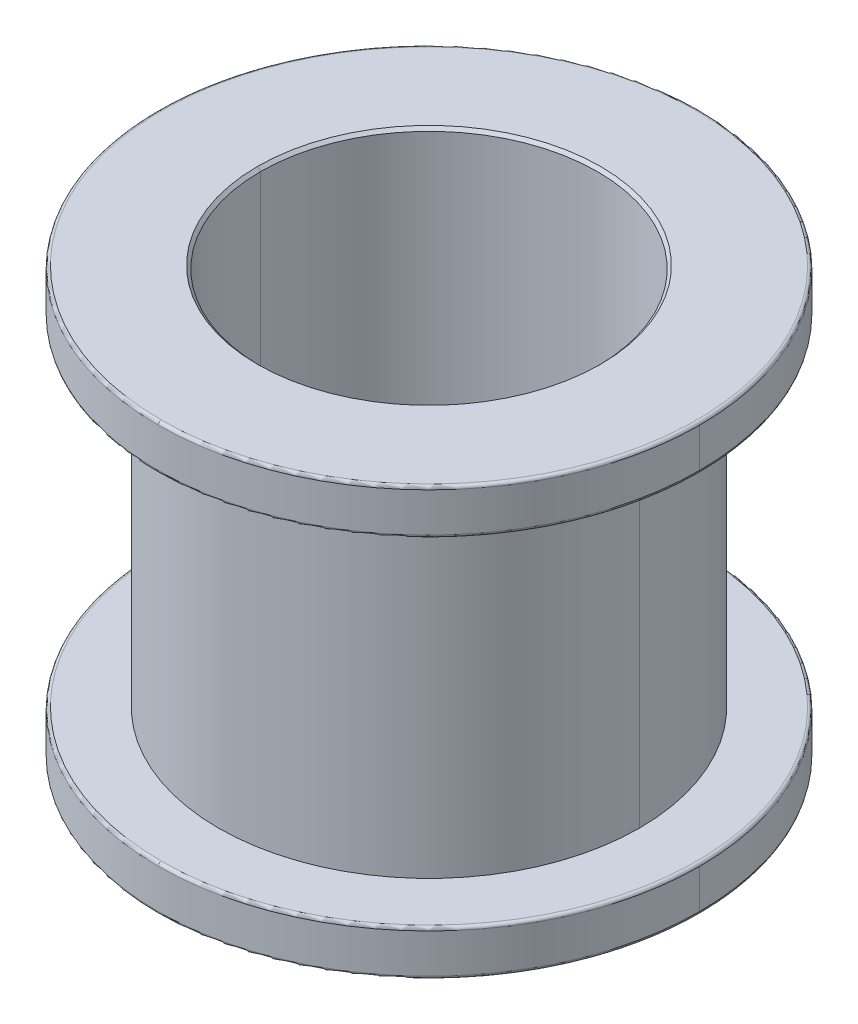
ISO-10303-21;
HEADER;
FILE_DESCRIPTION(('STEP AP214'),'2;1');
FILE_NAME('part.step','',(''),(''),'','','');
FILE_SCHEMA(('AUTOMOTIVE_DESIGN { 1 0 10303 214 1 1 1 1 }'));
ENDSEC;
DATA;
#1=APPLICATION_CONTEXT('core data for automotive mechanical design processes');
#2=APPLICATION_PROTOCOL_DEFINITION('international standard','automotive_design',2000,#1);
#3=PRODUCT_CONTEXT('',#1,'mechanical');
#4=PRODUCT('Part','Part','',(#3));
#5=PRODUCT_RELATED_PRODUCT_CATEGORY('part','',(#4));
#6=PRODUCT_DEFINITION_FORMATION('','',#4);
#7=PRODUCT_DEFINITION_CONTEXT('part definition',#1,'design');
#8=PRODUCT_DEFINITION('design','',#6,#7);
#9=PRODUCT_DEFINITION_SHAPE('','',#8);
#10=(LENGTH_UNIT() NAMED_UNIT(*) SI_UNIT(.MILLI.,.METRE.));
#11=(NAMED_UNIT(*) PLANE_ANGLE_UNIT() SI_UNIT($,.RADIAN.));
#12=(NAMED_UNIT(*) SI_UNIT($,.STERADIAN.) SOLID_ANGLE_UNIT());
#13=UNCERTAINTY_MEASURE_WITH_UNIT(LENGTH_MEASURE(1.E-05),#10,'distance_accuracy_value','');
#14=(GEOMETRIC_REPRESENTATION_CONTEXT(3) GLOBAL_UNCERTAINTY_ASSIGNED_CONTEXT((#13)) GLOBAL_UNIT_ASSIGNED_CONTEXT((#10,
#11,#12)) REPRESENTATION_CONTEXT('',''));
#15=CARTESIAN_POINT('',(0.,0.,0.));
#16=DIRECTION('',(0.,0.,1.));
#17=DIRECTION('',(1.,0.,0.));
#18=AXIS2_PLACEMENT_3D('',#15,#16,#17);
#19=CARTESIAN_POINT('',(0.,12.8,0.));
#20=DIRECTION('',(0.,-1.,0.));
#21=DIRECTION('',(0.,0.,-1.));
#22=AXIS2_PLACEMENT_3D('',#19,#20,#21);
#23=TOROIDAL_SURFACE('',#22,8.9,0.1);
#24=CARTESIAN_POINT('',(0.,12.8,-8.9));
#25=DIRECTION('',(1.,0.,0.));
#26=DIRECTION('',(0.,-1.,0.));
#27=AXIS2_PLACEMENT_3D('',#24,#25,#26);
#28=CIRCLE('',#27,0.1);
#29=CARTESIAN_POINT('',(0.,12.7,-8.9));
#30=VERTEX_POINT('',#29);
#31=CARTESIAN_POINT('',(0.,12.8,-9.));
#32=VERTEX_POINT('',#31);
#33=EDGE_CURVE('E273',#30,#32,#28,.T.);
#34=ORIENTED_EDGE('',*,*,#33,.T.);
#35=CARTESIAN_POINT('',(0.,12.8,0.));
#36=DIRECTION('',(0.,-1.,0.));
#37=DIRECTION('',(1.,0.,0.));
#38=AXIS2_PLACEMENT_3D('',#35,#36,#37);
#39=CIRCLE('',#38,9.);
#40=CARTESIAN_POINT('',(9.,12.8,0.));
#41=VERTEX_POINT('',#40);
#42=EDGE_CURVE('E327',#32,#41,#39,.T.);
#43=ORIENTED_EDGE('',*,*,#42,.T.);
#44=CARTESIAN_POINT('',(0.,12.8,0.));
#45=DIRECTION('',(0.,-1.,0.));
#46=DIRECTION('',(1.,0.,0.));
#47=AXIS2_PLACEMENT_3D('',#44,#45,#46);
#48=CIRCLE('',#47,9.);
#49=CARTESIAN_POINT('',(0.,12.8,9.));
#50=VERTEX_POINT('',#49);
#51=EDGE_CURVE('E277',#41,#50,#48,.T.);
#52=ORIENTED_EDGE('',*,*,#51,.T.);
#53=CARTESIAN_POINT('',(0.,12.8,8.9));
#54=DIRECTION('',(-1.,0.,0.));
#55=DIRECTION('',(0.,1.,0.));
#56=AXIS2_PLACEMENT_3D('',#53,#54,#55);
#57=CIRCLE('',#56,0.1);
#58=CARTESIAN_POINT('',(0.,12.7,8.9));
#59=VERTEX_POINT('',#58);
#60=EDGE_CURVE('E251',#59,#50,#57,.T.);
#61=ORIENTED_EDGE('',*,*,#60,.F.);
#62=CARTESIAN_POINT('',(0.,12.7,0.));
#63=DIRECTION('',(0.,1.,0.));
#64=DIRECTION('',(1.,0.,0.));
#65=AXIS2_PLACEMENT_3D('',#62,#63,#64);
#66=CIRCLE('',#65,8.9);
#67=EDGE_CURVE('E281',#59,#30,#66,.T.);
#68=ORIENTED_EDGE('',*,*,#67,.T.);
#69=EDGE_LOOP('',(#34,#43,#52,#61,#68));
#70=FACE_BOUND('',#69,.T.);
#71=ADVANCED_FACE('F17',(#70),#23,.T.);
#72=CARTESIAN_POINT('',(0.,14.1,0.));
#73=DIRECTION('',(0.,1.,0.));
#74=DIRECTION('',(0.,0.,-1.));
#75=AXIS2_PLACEMENT_3D('',#72,#73,#74);
#76=TOROIDAL_SURFACE('',#75,8.9,0.1);
#77=CARTESIAN_POINT('',(0.,14.1,8.9));
#78=DIRECTION('',(1.,0.,0.));
#79=DIRECTION('',(0.,-1.,0.));
#80=AXIS2_PLACEMENT_3D('',#77,#78,#79);
#81=CIRCLE('',#80,0.1);
#82=CARTESIAN_POINT('',(0.,14.2,8.9));
#83=VERTEX_POINT('',#82);
#84=CARTESIAN_POINT('',(0.,14.1,9.));
#85=VERTEX_POINT('',#84);
#86=EDGE_CURVE('E27',#83,#85,#81,.T.);
#87=ORIENTED_EDGE('',*,*,#86,.F.);
#88=CARTESIAN_POINT('',(0.,14.2,0.));
#89=DIRECTION('',(0.,-1.,0.));
#90=DIRECTION('',(1.,0.,0.));
#91=AXIS2_PLACEMENT_3D('',#88,#89,#90);
#92=CIRCLE('',#91,8.9);
#93=CARTESIAN_POINT('',(0.,14.2,-8.9));
#94=VERTEX_POINT('',#93);
#95=EDGE_CURVE('E294',#83,#94,#92,.T.);
#96=ORIENTED_EDGE('',*,*,#95,.T.);
#97=CARTESIAN_POINT('',(0.,14.1,-8.9));
#98=DIRECTION('',(-1.,0.,0.));
#99=DIRECTION('',(0.,1.,0.));
#100=AXIS2_PLACEMENT_3D('',#97,#98,#99);
#101=CIRCLE('',#100,0.1);
#102=CARTESIAN_POINT('',(0.,14.1,-9.));
#103=VERTEX_POINT('',#102);
#104=EDGE_CURVE('E11',#94,#103,#101,.T.);
#105=ORIENTED_EDGE('',*,*,#104,.T.);
#106=CARTESIAN_POINT('',(0.,14.1,0.));
#107=DIRECTION('',(0.,1.,0.));
#108=DIRECTION('',(1.,0.,0.));
#109=AXIS2_PLACEMENT_3D('',#106,#107,#108);
#110=CIRCLE('',#109,9.);
#111=CARTESIAN_POINT('',(-9.,14.1,0.));
#112=VERTEX_POINT('',#111);
#113=EDGE_CURVE('E308',#103,#112,#110,.T.);
#114=ORIENTED_EDGE('',*,*,#113,.T.);
#115=CARTESIAN_POINT('',(0.,14.1,0.));
#116=DIRECTION('',(0.,1.,0.));
#117=DIRECTION('',(1.,0.,0.));
#118=AXIS2_PLACEMENT_3D('',#115,#116,#117);
#119=CIRCLE('',#118,9.);
#120=EDGE_CURVE('E240',#112,#85,#119,.T.);
#121=ORIENTED_EDGE('',*,*,#120,.T.);
#122=EDGE_LOOP('',(#87,#96,#105,#114,#121));
#123=FACE_BOUND('',#122,.T.);
#124=ADVANCED_FACE('F655',(#123),#76,.T.);
#125=CARTESIAN_POINT('',(0.,14.1,0.));
#126=DIRECTION('',(0.,1.,0.));
#127=DIRECTION('',(0.,0.,1.));
#128=AXIS2_PLACEMENT_3D('',#125,#126,#127);
#129=TOROIDAL_SURFACE('',#128,8.9,0.1);
#130=ORIENTED_EDGE('',*,*,#86,.T.);
#131=CARTESIAN_POINT('',(0.,14.1,0.));
#132=DIRECTION('',(0.,1.,0.));
#133=DIRECTION('',(1.,0.,0.));
#134=AXIS2_PLACEMENT_3D('',#131,#132,#133);
#135=CIRCLE('',#134,9.);
#136=CARTESIAN_POINT('',(9.,14.1,0.));
#137=VERTEX_POINT('',#136);
#138=EDGE_CURVE('E237',#85,#137,#135,.T.);
#139=ORIENTED_EDGE('',*,*,#138,.T.);
#140=CARTESIAN_POINT('',(0.,14.1,0.));
#141=DIRECTION('',(0.,1.,0.));
#142=DIRECTION('',(1.,0.,0.));
#143=AXIS2_PLACEMENT_3D('',#140,#141,#142);
#144=CIRCLE('',#143,9.);
#145=EDGE_CURVE('E241',#137,#103,#144,.T.);
#146=ORIENTED_EDGE('',*,*,#145,.T.);
#147=ORIENTED_EDGE('',*,*,#104,.F.);
#148=CARTESIAN_POINT('',(0.,14.2,0.));
#149=DIRECTION('',(0.,-1.,0.));
#150=DIRECTION('',(1.,0.,0.));
#151=AXIS2_PLACEMENT_3D('',#148,#149,#150);
#152=CIRCLE('',#151,8.9);
#153=EDGE_CURVE('E272',#94,#83,#152,.T.);
#154=ORIENTED_EDGE('',*,*,#153,.T.);
#155=EDGE_LOOP('',(#130,#139,#146,#147,#154));
#156=FACE_BOUND('',#155,.T.);
#157=ADVANCED_FACE('F359',(#156),#129,.T.);
#158=CARTESIAN_POINT('',(0.,7.1,0.));
#159=DIRECTION('',(0.,1.,0.));
#160=DIRECTION('',(1.,0.,0.));
#161=AXIS2_PLACEMENT_3D('',#158,#159,#160);
#162=CYLINDRICAL_SURFACE('',#161,7.);
#163=DIRECTION('',(0.,-1.,0.));
#164=VECTOR('',#163,1.);
#165=CARTESIAN_POINT('',(7.,7.09999999963,0.));
#166=LINE('',#165,#164);
#167=CARTESIAN_POINT('',(7.,12.7,0.));
#168=VERTEX_POINT('',#167);
#169=CARTESIAN_POINT('',(7.,1.5,0.));
#170=VERTEX_POINT('',#169);
#171=EDGE_CURVE('E166',#168,#170,#166,.T.);
#172=ORIENTED_EDGE('',*,*,#171,.F.);
#173=CARTESIAN_POINT('',(0.,12.7,0.));
#174=DIRECTION('',(0.,-1.,0.));
#175=DIRECTION('',(1.,0.,0.));
#176=AXIS2_PLACEMENT_3D('',#173,#174,#175);
#177=CIRCLE('',#176,7.);
#178=CARTESIAN_POINT('',(-7.,12.7,0.));
#179=VERTEX_POINT('',#178);
#180=EDGE_CURVE('E288',#168,#179,#177,.T.);
#181=ORIENTED_EDGE('',*,*,#180,.T.);
#182=DIRECTION('',(0.,-1.,0.));
#183=VECTOR('',#182,1.);
#184=CARTESIAN_POINT('',(-7.,7.09999999963,0.));
#185=LINE('',#184,#183);
#186=CARTESIAN_POINT('',(-7.,1.5,0.));
#187=VERTEX_POINT('',#186);
#188=EDGE_CURVE('E177',#179,#187,#185,.T.);
#189=ORIENTED_EDGE('',*,*,#188,.T.);
#190=CARTESIAN_POINT('',(0.,1.5,0.));
#191=DIRECTION('',(0.,1.,0.));
#192=DIRECTION('',(-1.,0.,0.));
#193=AXIS2_PLACEMENT_3D('',#190,#191,#192);
#194=CIRCLE('',#193,7.);
#195=EDGE_CURVE('E341',#187,#170,#194,.T.);
#196=ORIENTED_EDGE('',*,*,#195,.T.);
#197=EDGE_LOOP('',(#172,#181,#189,#196));
#198=FACE_BOUND('',#197,.T.);
#199=ADVANCED_FACE('F348',(#198),#162,.T.);
#200=CARTESIAN_POINT('',(0.,7.1,0.));
#201=DIRECTION('',(0.,1.,0.));
#202=DIRECTION('',(1.,0.,0.));
#203=AXIS2_PLACEMENT_3D('',#200,#201,#202);
#204=CYLINDRICAL_SURFACE('',#203,7.);
#205=ORIENTED_EDGE('',*,*,#171,.T.);
#206=CARTESIAN_POINT('',(0.,1.50000000037,0.));
#207=DIRECTION('',(0.,1.,0.));
#208=DIRECTION('',(1.,0.,0.));
#209=AXIS2_PLACEMENT_3D('',#206,#207,#208);
#210=CIRCLE('',#209,7.);
#211=EDGE_CURVE('E430',#170,#187,#210,.T.);
#212=ORIENTED_EDGE('',*,*,#211,.T.);
#213=ORIENTED_EDGE('',*,*,#188,.F.);
#214=CARTESIAN_POINT('',(0.,12.6999999996,0.));
#215=DIRECTION('',(0.,-1.,0.));
#216=DIRECTION('',(1.,0.,0.));
#217=AXIS2_PLACEMENT_3D('',#214,#215,#216);
#218=CIRCLE('',#217,7.);
#219=EDGE_CURVE('E298',#179,#168,#218,.T.);
#220=ORIENTED_EDGE('',*,*,#219,.T.);
#221=EDGE_LOOP('',(#205,#212,#213,#220));
#222=FACE_BOUND('',#221,.T.);
#223=ADVANCED_FACE('F358',(#222),#204,.T.);
#224=CARTESIAN_POINT('',(0.,14.15,0.));
#225=DIRECTION('',(0.,1.,0.));
#226=DIRECTION('',(-1.,0.,0.));
#227=AXIS2_PLACEMENT_3D('',#224,#225,#226);
#228=CONICAL_SURFACE('',#227,5.65,0.785398163397001);
#229=CARTESIAN_POINT('',(0.,14.2,0.));
#230=DIRECTION('',(0.,1.,0.));
#231=DIRECTION('',(1.,0.,0.));
#232=AXIS2_PLACEMENT_3D('',#229,#230,#231);
#233=CIRCLE('',#232,5.7);
#234=CARTESIAN_POINT('',(-5.69999999925,14.2,0.));
#235=VERTEX_POINT('',#234);
#236=CARTESIAN_POINT('',(5.69999999925,14.2,0.));
#237=VERTEX_POINT('',#236);
#238=EDGE_CURVE('E267',#235,#237,#233,.T.);
#239=ORIENTED_EDGE('',*,*,#238,.T.);
#240=DIRECTION('',(0.707106781186548,0.707106781186548,0.));
#241=VECTOR('',#240,1.);
#242=CARTESIAN_POINT('',(3535536.73093,3535545.23093,-3.52070369917E-10));
#243=LINE('',#242,#241);
#244=CARTESIAN_POINT('',(5.6,14.1,0.));
#245=VERTEX_POINT('',#244);
#246=EDGE_CURVE('E260',#245,#237,#243,.T.);
#247=ORIENTED_EDGE('',*,*,#246,.F.);
#248=CARTESIAN_POINT('',(0.,14.1,0.));
#249=DIRECTION('',(0.,-1.,0.));
#250=DIRECTION('',(1.,0.,0.));
#251=AXIS2_PLACEMENT_3D('',#248,#249,#250);
#252=CIRCLE('',#251,5.6);
#253=CARTESIAN_POINT('',(-5.6,14.1,0.));
#254=VERTEX_POINT('',#253);
#255=EDGE_CURVE('E315',#245,#254,#252,.T.);
#256=ORIENTED_EDGE('',*,*,#255,.T.);
#257=DIRECTION('',(0.707106781186548,-0.707106781186548,0.));
#258=VECTOR('',#257,1.);
#259=CARTESIAN_POINT('',(-3535536.73093,3535545.23093,-7.85048743997E-10));
#260=LINE('',#259,#258);
#261=EDGE_CURVE('E263',#235,#254,#260,.T.);
#262=ORIENTED_EDGE('',*,*,#261,.F.);
#263=EDGE_LOOP('',(#239,#247,#256,#262));
#264=FACE_BOUND('',#263,.T.);
#265=ADVANCED_FACE('F407',(#264),#228,.F.);
#266=CARTESIAN_POINT('',(0.,14.15,0.));
#267=DIRECTION('',(0.,1.,0.));
#268=DIRECTION('',(-1.,0.,0.));
#269=AXIS2_PLACEMENT_3D('',#266,#267,#268);
#270=CONICAL_SURFACE('',#269,5.65,0.785398163397001);
#271=CARTESIAN_POINT('',(0.,14.1,0.));
#272=DIRECTION('',(0.,-1.,0.));
#273=DIRECTION('',(1.,0.,0.));
#274=AXIS2_PLACEMENT_3D('',#271,#272,#273);
#275=CIRCLE('',#274,5.6);
#276=EDGE_CURVE('E224',#254,#245,#275,.T.);
#277=ORIENTED_EDGE('',*,*,#276,.T.);
#278=ORIENTED_EDGE('',*,*,#246,.T.);
#279=CARTESIAN_POINT('',(0.,14.2,0.));
#280=DIRECTION('',(0.,1.,0.));
#281=DIRECTION('',(1.,0.,0.));
#282=AXIS2_PLACEMENT_3D('',#279,#280,#281);
#283=CIRCLE('',#282,5.7);
#284=EDGE_CURVE('E271',#237,#235,#283,.T.);
#285=ORIENTED_EDGE('',*,*,#284,.T.);
#286=ORIENTED_EDGE('',*,*,#261,.T.);
#287=EDGE_LOOP('',(#277,#278,#285,#286));
#288=FACE_BOUND('',#287,.T.);
#289=ADVANCED_FACE('F621',(#288),#270,.F.);
#290=CARTESIAN_POINT('',(0.,1.4,0.));
#291=DIRECTION('',(0.,1.,0.));
#292=DIRECTION('',(0.,0.,-1.));
#293=AXIS2_PLACEMENT_3D('',#290,#291,#292);
#294=TOROIDAL_SURFACE('',#293,8.9,0.1);
#295=CARTESIAN_POINT('',(0.,1.4,8.9));
#296=DIRECTION('',(1.,0.,0.));
#297=DIRECTION('',(0.,-1.,0.));
#298=AXIS2_PLACEMENT_3D('',#295,#296,#297);
#299=CIRCLE('',#298,0.1);
#300=CARTESIAN_POINT('',(0.,1.5,8.9));
#301=VERTEX_POINT('',#300);
#302=CARTESIAN_POINT('',(0.,1.4,9.));
#303=VERTEX_POINT('',#302);
#304=EDGE_CURVE('E247',#301,#303,#299,.T.);
#305=ORIENTED_EDGE('',*,*,#304,.F.);
#306=CARTESIAN_POINT('',(0.,1.5,0.));
#307=DIRECTION('',(0.,-1.,0.));
#308=DIRECTION('',(1.,0.,0.));
#309=AXIS2_PLACEMENT_3D('',#306,#307,#308);
#310=CIRCLE('',#309,8.9);
#311=CARTESIAN_POINT('',(0.,1.5,-8.9));
#312=VERTEX_POINT('',#311);
#313=EDGE_CURVE('E282',#301,#312,#310,.T.);
#314=ORIENTED_EDGE('',*,*,#313,.T.);
#315=CARTESIAN_POINT('',(0.,1.4,-8.9));
#316=DIRECTION('',(-1.,0.,0.));
#317=DIRECTION('',(0.,1.,0.));
#318=AXIS2_PLACEMENT_3D('',#315,#316,#317);
#319=CIRCLE('',#318,0.1);
#320=CARTESIAN_POINT('',(0.,1.4,-9.));
#321=VERTEX_POINT('',#320);
#322=EDGE_CURVE('E250',#312,#321,#319,.T.);
#323=ORIENTED_EDGE('',*,*,#322,.T.);
#324=CARTESIAN_POINT('',(0.,1.4,0.));
#325=DIRECTION('',(0.,1.,0.));
#326=DIRECTION('',(1.,0.,0.));
#327=AXIS2_PLACEMENT_3D('',#324,#325,#326);
#328=CIRCLE('',#327,9.);
#329=CARTESIAN_POINT('',(-9.,1.4,0.));
#330=VERTEX_POINT('',#329);
#331=EDGE_CURVE('E242',#321,#330,#328,.T.);
#332=ORIENTED_EDGE('',*,*,#331,.T.);
#333=CARTESIAN_POINT('',(0.,1.4,0.));
#334=DIRECTION('',(0.,1.,0.));
#335=DIRECTION('',(1.,0.,0.));
#336=AXIS2_PLACEMENT_3D('',#333,#334,#335);
#337=CIRCLE('',#336,9.);
#338=EDGE_CURVE('E322',#330,#303,#337,.T.);
#339=ORIENTED_EDGE('',*,*,#338,.T.);
#340=EDGE_LOOP('',(#305,#314,#323,#332,#339));
#341=FACE_BOUND('',#340,.T.);
#342=ADVANCED_FACE('F394',(#341),#294,.T.);
#343=CARTESIAN_POINT('',(0.,1.4,0.));
#344=DIRECTION('',(0.,1.,0.));
#345=DIRECTION('',(0.,0.,1.));
#346=AXIS2_PLACEMENT_3D('',#343,#344,#345);
#347=TOROIDAL_SURFACE('',#346,8.9,0.1);
#348=ORIENTED_EDGE('',*,*,#304,.T.);
#349=CARTESIAN_POINT('',(0.,1.4,0.));
#350=DIRECTION('',(0.,1.,0.));
#351=DIRECTION('',(1.,0.,0.));
#352=AXIS2_PLACEMENT_3D('',#349,#350,#351);
#353=CIRCLE('',#352,9.);
#354=CARTESIAN_POINT('',(9.,1.4,0.));
#355=VERTEX_POINT('',#354);
#356=EDGE_CURVE('E319',#303,#355,#353,.T.);
#357=ORIENTED_EDGE('',*,*,#356,.T.);
#358=CARTESIAN_POINT('',(0.,1.4,0.));
#359=DIRECTION('',(0.,1.,0.));
#360=DIRECTION('',(1.,0.,0.));
#361=AXIS2_PLACEMENT_3D('',#358,#359,#360);
#362=CIRCLE('',#361,9.);
#363=EDGE_CURVE('E246',#355,#321,#362,.T.);
#364=ORIENTED_EDGE('',*,*,#363,.T.);
#365=ORIENTED_EDGE('',*,*,#322,.F.);
#366=CARTESIAN_POINT('',(0.,1.5,0.));
#367=DIRECTION('',(0.,-1.,0.));
#368=DIRECTION('',(1.,0.,0.));
#369=AXIS2_PLACEMENT_3D('',#366,#367,#368);
#370=CIRCLE('',#369,8.9);
#371=EDGE_CURVE('E286',#312,#301,#370,.T.);
#372=ORIENTED_EDGE('',*,*,#371,.T.);
#373=EDGE_LOOP('',(#348,#357,#364,#365,#372));
#374=FACE_BOUND('',#373,.T.);
#375=ADVANCED_FACE('F408',(#374),#347,.T.);
#376=CARTESIAN_POINT('',(0.,0.05,0.));
#377=DIRECTION('',(0.,-1.,0.));
#378=DIRECTION('',(-1.,0.,0.));
#379=AXIS2_PLACEMENT_3D('',#376,#377,#378);
#380=CONICAL_SURFACE('',#379,5.65,0.785398163397001);
#381=CARTESIAN_POINT('',(0.,0.1,0.));
#382=DIRECTION('',(0.,1.,0.));
#383=DIRECTION('',(1.,0.,0.));
#384=AXIS2_PLACEMENT_3D('',#381,#382,#383);
#385=CIRCLE('',#384,5.6);
#386=CARTESIAN_POINT('',(-5.6,0.1,0.));
#387=VERTEX_POINT('',#386);
#388=CARTESIAN_POINT('',(5.6,0.100000000373,0.));
#389=VERTEX_POINT('',#388);
#390=EDGE_CURVE('E314',#387,#389,#385,.T.);
#391=ORIENTED_EDGE('',*,*,#390,.T.);
#392=DIRECTION('',(0.707106781186548,-0.707106781186548,0.));
#393=VECTOR('',#392,1.);
#394=CARTESIAN_POINT('',(3535536.73093,-3535531.03093,3.52067216883E-10));
#395=LINE('',#394,#393);
#396=CARTESIAN_POINT('',(5.69999999925,0.,0.));
#397=VERTEX_POINT('',#396);
#398=EDGE_CURVE('E266',#389,#397,#395,.T.);
#399=ORIENTED_EDGE('',*,*,#398,.T.);
#400=CARTESIAN_POINT('',(0.,0.,0.));
#401=DIRECTION('',(0.,-1.,0.));
#402=DIRECTION('',(1.,0.,0.));
#403=AXIS2_PLACEMENT_3D('',#400,#401,#402);
#404=CIRCLE('',#403,5.7);
#405=CARTESIAN_POINT('',(-5.69999999925,0.,0.));
#406=VERTEX_POINT('',#405);
#407=EDGE_CURVE('E96',#397,#406,#404,.T.);
#408=ORIENTED_EDGE('',*,*,#407,.T.);
#409=DIRECTION('',(0.707106781186548,0.707106781186548,0.));
#410=VECTOR('',#409,1.);
#411=CARTESIAN_POINT('',(-3535536.73093,-3535531.03093,1.65100233912E-09));
#412=LINE('',#411,#410);
#413=EDGE_CURVE('E234',#406,#387,#412,.T.);
#414=ORIENTED_EDGE('',*,*,#413,.T.);
#415=EDGE_LOOP('',(#391,#399,#408,#414));
#416=FACE_BOUND('',#415,.T.);
#417=ADVANCED_FACE('F411',(#416),#380,.F.);
#418=CARTESIAN_POINT('',(0.,0.1,0.));
#419=DIRECTION('',(0.,-1.,0.));
#420=DIRECTION('',(0.,0.,-1.));
#421=AXIS2_PLACEMENT_3D('',#418,#419,#420);
#422=TOROIDAL_SURFACE('',#421,8.9,0.1);
#423=CARTESIAN_POINT('',(0.,0.1,-8.9));
#424=DIRECTION('',(1.,0.,0.));
#425=DIRECTION('',(0.,-1.,0.));
#426=AXIS2_PLACEMENT_3D('',#423,#424,#425);
#427=CIRCLE('',#426,0.1);
#428=CARTESIAN_POINT('',(0.,0.,-8.9));
#429=VERTEX_POINT('',#428);
#430=CARTESIAN_POINT('',(0.,0.1,-9.));
#431=VERTEX_POINT('',#430);
#432=EDGE_CURVE('E192',#429,#431,#427,.T.);
#433=ORIENTED_EDGE('',*,*,#432,.T.);
#434=CARTESIAN_POINT('',(0.,0.1,0.));
#435=DIRECTION('',(0.,-1.,0.));
#436=DIRECTION('',(1.,0.,0.));
#437=AXIS2_PLACEMENT_3D('',#434,#435,#436);
#438=CIRCLE('',#437,9.);
#439=CARTESIAN_POINT('',(9.,0.1,0.));
#440=VERTEX_POINT('',#439);
#441=EDGE_CURVE('E196',#431,#440,#438,.T.);
#442=ORIENTED_EDGE('',*,*,#441,.T.);
#443=CARTESIAN_POINT('',(0.,0.1,0.));
#444=DIRECTION('',(0.,-1.,0.));
#445=DIRECTION('',(1.,0.,0.));
#446=AXIS2_PLACEMENT_3D('',#443,#444,#445);
#447=CIRCLE('',#446,9.);
#448=CARTESIAN_POINT('',(0.,0.1,9.));
#449=VERTEX_POINT('',#448);
#450=EDGE_CURVE('E339',#440,#449,#447,.T.);
#451=ORIENTED_EDGE('',*,*,#450,.T.);
#452=CARTESIAN_POINT('',(0.,0.1,8.9));
#453=DIRECTION('',(-1.,0.,0.));
#454=DIRECTION('',(0.,1.,0.));
#455=AXIS2_PLACEMENT_3D('',#452,#453,#454);
#456=CIRCLE('',#455,0.1);
#457=CARTESIAN_POINT('',(0.,0.,8.9));
#458=VERTEX_POINT('',#457);
#459=EDGE_CURVE('E42',#458,#449,#456,.T.);
#460=ORIENTED_EDGE('',*,*,#459,.F.);
#461=CARTESIAN_POINT('',(0.,0.,0.));
#462=DIRECTION('',(0.,1.,0.));
#463=DIRECTION('',(1.,0.,0.));
#464=AXIS2_PLACEMENT_3D('',#461,#462,#463);
#465=CIRCLE('',#464,8.9);
#466=EDGE_CURVE('E198',#458,#429,#465,.T.);
#467=ORIENTED_EDGE('',*,*,#466,.T.);
#468=EDGE_LOOP('',(#433,#442,#451,#460,#467));
#469=FACE_BOUND('',#468,.T.);
#470=ADVANCED_FACE('F194',(#469),#422,.T.);
#471=CARTESIAN_POINT('',(0.,0.1,0.));
#472=DIRECTION('',(0.,-1.,0.));
#473=DIRECTION('',(0.,0.,1.));
#474=AXIS2_PLACEMENT_3D('',#471,#472,#473);
#475=TOROIDAL_SURFACE('',#474,8.9,0.1);
#476=ORIENTED_EDGE('',*,*,#432,.F.);
#477=CARTESIAN_POINT('',(0.,0.,0.));
#478=DIRECTION('',(0.,1.,0.));
#479=DIRECTION('',(1.,0.,0.));
#480=AXIS2_PLACEMENT_3D('',#477,#478,#479);
#481=CIRCLE('',#480,8.9);
#482=EDGE_CURVE('E232',#429,#458,#481,.T.);
#483=ORIENTED_EDGE('',*,*,#482,.T.);
#484=ORIENTED_EDGE('',*,*,#459,.T.);
#485=CARTESIAN_POINT('',(0.,0.1,0.));
#486=DIRECTION('',(0.,-1.,0.));
#487=DIRECTION('',(1.,0.,0.));
#488=AXIS2_PLACEMENT_3D('',#485,#486,#487);
#489=CIRCLE('',#488,9.);
#490=CARTESIAN_POINT('',(-9.,0.1,0.));
#491=VERTEX_POINT('',#490);
#492=EDGE_CURVE('E206',#449,#491,#489,.T.);
#493=ORIENTED_EDGE('',*,*,#492,.T.);
#494=CARTESIAN_POINT('',(0.,0.1,0.));
#495=DIRECTION('',(0.,-1.,0.));
#496=DIRECTION('',(1.,0.,0.));
#497=AXIS2_PLACEMENT_3D('',#494,#495,#496);
#498=CIRCLE('',#497,9.);
#499=EDGE_CURVE('E203',#491,#431,#498,.T.);
#500=ORIENTED_EDGE('',*,*,#499,.T.);
#501=EDGE_LOOP('',(#476,#483,#484,#493,#500));
#502=FACE_BOUND('',#501,.T.);
#503=ADVANCED_FACE('F204',(#502),#475,.T.);
#504=CARTESIAN_POINT('',(0.,0.,0.));
#505=DIRECTION('',(0.,-1.,0.));
#506=DIRECTION('',(-1.,0.,0.));
#507=AXIS2_PLACEMENT_3D('',#504,#505,#506);
#508=PLANE('',#507);
#509=CARTESIAN_POINT('',(0.,0.,0.));
#510=DIRECTION('',(0.,-1.,0.));
#511=DIRECTION('',(1.,0.,0.));
#512=AXIS2_PLACEMENT_3D('',#509,#510,#511);
#513=CIRCLE('',#512,5.69999999925);
#514=EDGE_CURVE('E335',#406,#397,#513,.T.);
#515=ORIENTED_EDGE('',*,*,#514,.F.);
#516=ORIENTED_EDGE('',*,*,#407,.F.);
#517=EDGE_LOOP('',(#515,#516));
#518=FACE_BOUND('',#517,.T.);
#519=ORIENTED_EDGE('',*,*,#482,.F.);
#520=ORIENTED_EDGE('',*,*,#466,.F.);
#521=EDGE_LOOP('',(#519,#520));
#522=FACE_BOUND('',#521,.T.);
#523=ADVANCED_FACE('F704',(#518,#522),#508,.T.);
#524=CARTESIAN_POINT('',(0.,0.05,0.));
#525=DIRECTION('',(0.,-1.,0.));
#526=DIRECTION('',(-1.,0.,0.));
#527=AXIS2_PLACEMENT_3D('',#524,#525,#526);
#528=CONICAL_SURFACE('',#527,5.65,0.785398163397001);
#529=ORIENTED_EDGE('',*,*,#514,.T.);
#530=ORIENTED_EDGE('',*,*,#398,.F.);
#531=CARTESIAN_POINT('',(0.,0.1,0.));
#532=DIRECTION('',(0.,1.,0.));
#533=DIRECTION('',(1.,0.,0.));
#534=AXIS2_PLACEMENT_3D('',#531,#532,#533);
#535=CIRCLE('',#534,5.6);
#536=EDGE_CURVE('E259',#389,#387,#535,.T.);
#537=ORIENTED_EDGE('',*,*,#536,.T.);
#538=ORIENTED_EDGE('',*,*,#413,.F.);
#539=EDGE_LOOP('',(#529,#530,#537,#538));
#540=FACE_BOUND('',#539,.T.);
#541=ADVANCED_FACE('F403',(#540),#528,.F.);
#542=CARTESIAN_POINT('',(0.,0.8,0.));
#543=DIRECTION('',(0.,1.,0.));
#544=DIRECTION('',(1.,0.,0.));
#545=AXIS2_PLACEMENT_3D('',#542,#543,#544);
#546=CYLINDRICAL_SURFACE('',#545,9.);
#547=DIRECTION('',(0.,-1.,0.));
#548=VECTOR('',#547,1.);
#549=CARTESIAN_POINT('',(9.,0.800000000745,0.));
#550=LINE('',#549,#548);
#551=EDGE_CURVE('E216',#355,#440,#550,.T.);
#552=ORIENTED_EDGE('',*,*,#551,.F.);
#553=ORIENTED_EDGE('',*,*,#356,.F.);
#554=ORIENTED_EDGE('',*,*,#338,.F.);
#555=DIRECTION('',(0.,-1.,0.));
#556=VECTOR('',#555,1.);
#557=CARTESIAN_POINT('',(-9.,0.800000000745,0.));
#558=LINE('',#557,#556);
#559=EDGE_CURVE('E211',#330,#491,#558,.T.);
#560=ORIENTED_EDGE('',*,*,#559,.T.);
#561=ORIENTED_EDGE('',*,*,#492,.F.);
#562=ORIENTED_EDGE('',*,*,#450,.F.);
#563=EDGE_LOOP('',(#552,#553,#554,#560,#561,#562));
#564=FACE_BOUND('',#563,.T.);
#565=ADVANCED_FACE('F400',(#564),#546,.T.);
#566=CARTESIAN_POINT('',(0.,0.8,0.));
#567=DIRECTION('',(0.,1.,0.));
#568=DIRECTION('',(1.,0.,0.));
#569=AXIS2_PLACEMENT_3D('',#566,#567,#568);
#570=CYLINDRICAL_SURFACE('',#569,9.);
#571=ORIENTED_EDGE('',*,*,#551,.T.);
#572=ORIENTED_EDGE('',*,*,#441,.F.);
#573=ORIENTED_EDGE('',*,*,#499,.F.);
#574=ORIENTED_EDGE('',*,*,#559,.F.);
#575=ORIENTED_EDGE('',*,*,#331,.F.);
#576=ORIENTED_EDGE('',*,*,#363,.F.);
#577=EDGE_LOOP('',(#571,#572,#573,#574,#575,#576));
#578=FACE_BOUND('',#577,.T.);
#579=ADVANCED_FACE('F213',(#578),#570,.T.);
#580=CARTESIAN_POINT('',(0.,14.2,0.));
#581=DIRECTION('',(0.,-1.,0.));
#582=DIRECTION('',(-1.,0.,0.));
#583=AXIS2_PLACEMENT_3D('',#580,#581,#582);
#584=CYLINDRICAL_SURFACE('',#583,5.6);
#585=ORIENTED_EDGE('',*,*,#536,.F.);
#586=DIRECTION('',(0.,-1.,0.));
#587=VECTOR('',#586,1.);
#588=CARTESIAN_POINT('',(5.6,14.1999999993,0.));
#589=LINE('',#588,#587);
#590=EDGE_CURVE('E310',#245,#389,#589,.T.);
#591=ORIENTED_EDGE('',*,*,#590,.F.);
#592=ORIENTED_EDGE('',*,*,#276,.F.);
#593=DIRECTION('',(0.,1.,0.));
#594=VECTOR('',#593,1.);
#595=CARTESIAN_POINT('',(-5.6,14.1999999993,0.));
#596=LINE('',#595,#594);
#597=EDGE_CURVE('E305',#387,#254,#596,.T.);
#598=ORIENTED_EDGE('',*,*,#597,.F.);
#599=EDGE_LOOP('',(#585,#591,#592,#598));
#600=FACE_BOUND('',#599,.T.);
#601=ADVANCED_FACE('F395',(#600),#584,.F.);
#602=CARTESIAN_POINT('',(0.,14.2,0.));
#603=DIRECTION('',(0.,-1.,0.));
#604=DIRECTION('',(-1.,0.,0.));
#605=AXIS2_PLACEMENT_3D('',#602,#603,#604);
#606=CYLINDRICAL_SURFACE('',#605,5.6);
#607=ORIENTED_EDGE('',*,*,#255,.F.);
#608=ORIENTED_EDGE('',*,*,#590,.T.);
#609=ORIENTED_EDGE('',*,*,#390,.F.);
#610=ORIENTED_EDGE('',*,*,#597,.T.);
#611=EDGE_LOOP('',(#607,#608,#609,#610));
#612=FACE_BOUND('',#611,.T.);
#613=ADVANCED_FACE('F398',(#612),#606,.F.);
#614=CARTESIAN_POINT('',(0.,1.5,0.));
#615=DIRECTION('',(0.,1.,0.));
#616=DIRECTION('',(0.,0.,-1.));
#617=AXIS2_PLACEMENT_3D('',#614,#615,#616);
#618=PLANE('',#617);
#619=ORIENTED_EDGE('',*,*,#211,.F.);
#620=ORIENTED_EDGE('',*,*,#195,.F.);
#621=EDGE_LOOP('',(#619,#620));
#622=FACE_BOUND('',#621,.T.);
#623=ORIENTED_EDGE('',*,*,#313,.F.);
#624=ORIENTED_EDGE('',*,*,#371,.F.);
#625=EDGE_LOOP('',(#623,#624));
#626=FACE_BOUND('',#625,.T.);
#627=ADVANCED_FACE('F413',(#622,#626),#618,.T.);
#628=CARTESIAN_POINT('',(0.,14.2,0.));
#629=DIRECTION('',(0.,1.,0.));
#630=DIRECTION('',(0.,0.,-1.));
#631=AXIS2_PLACEMENT_3D('',#628,#629,#630);
#632=PLANE('',#631);
#633=ORIENTED_EDGE('',*,*,#238,.F.);
#634=ORIENTED_EDGE('',*,*,#284,.F.);
#635=EDGE_LOOP('',(#633,#634));
#636=FACE_BOUND('',#635,.T.);
#637=ORIENTED_EDGE('',*,*,#95,.F.);
#638=ORIENTED_EDGE('',*,*,#153,.F.);
#639=EDGE_LOOP('',(#637,#638));
#640=FACE_BOUND('',#639,.T.);
#641=ADVANCED_FACE('F393',(#636,#640),#632,.T.);
#642=CARTESIAN_POINT('',(0.,12.7,0.));
#643=DIRECTION('',(0.,-1.,0.));
#644=DIRECTION('',(-1.,0.,0.));
#645=AXIS2_PLACEMENT_3D('',#642,#643,#644);
#646=PLANE('',#645);
#647=ORIENTED_EDGE('',*,*,#180,.F.);
#648=ORIENTED_EDGE('',*,*,#219,.F.);
#649=EDGE_LOOP('',(#647,#648));
#650=FACE_BOUND('',#649,.T.);
#651=CARTESIAN_POINT('',(0.,12.7,-8.9));
#652=CARTESIAN_POINT('',(-0.876894150704,12.7,-8.90000000037));
#653=CARTESIAN_POINT('',(-1.75378787239,12.7,-8.79200233864));
#654=CARTESIAN_POINT('',(-2.61298956826,12.7,-8.57597607046));
#655=CARTESIAN_POINT('',(-4.2603851519,12.7,-7.93682179775));
#656=CARTESIAN_POINT('',(-5.70346674008,12.7,-6.91704736003));
#657=CARTESIAN_POINT('',(-6.35832657989,12.7,-6.32034517553));
#658=CARTESIAN_POINT('',(-7.50753229455,12.7,-4.9780498927));
#659=CARTESIAN_POINT('',(-8.29670326015,12.7,-3.39702694254));
#660=CARTESIAN_POINT('',(-8.59147743083,12.7,-2.56156116085));
#661=CARTESIAN_POINT('',(-8.96918032948,12.7,-0.835359858412));
#662=CARTESIAN_POINT('',(-8.91675395855,12.7,0.930900561993));
#663=CARTESIAN_POINT('',(-8.78133701108,12.7,1.80643304379));
#664=CARTESIAN_POINT('',(-8.29770888035,12.7,3.50600188698));
#665=CARTESIAN_POINT('',(-7.41615361355,12.7,5.03743412963));
#666=CARTESIAN_POINT('',(-6.8827514461,12.7,5.74480744317));
#667=CARTESIAN_POINT('',(-5.65281244907,12.7,7.01353928457));
#668=CARTESIAN_POINT('',(-4.15178654385,12.7,7.94592634708));
#669=CARTESIAN_POINT('',(-3.34725696782,12.7,8.31690752802));
#670=CARTESIAN_POINT('',(-2.1882094583,12.7,8.68598517261));
#671=CARTESIAN_POINT('',(-0.991359534841,12.7,8.85387843171));
#672=CARTESIAN_POINT('',(-0.660751325828,12.7,8.88467021687));
#673=CARTESIAN_POINT('',(-0.330375632465,12.7,8.90000000037));
#674=CARTESIAN_POINT('',(0.,12.7,8.9));
#675=(BOUNDED_CURVE() B_SPLINE_CURVE(5,(#651,#652,#653,#654,#655,#656,#657,#658,#659,#660,#661,
#662,#663,#664,#665,#666,#667,#668,#669,#670,#671,#672,#673,#674),.UNSPECIFIED.,.F.,
.F.) B_SPLINE_CURVE_WITH_KNOTS((6,3,3,3,3,3,3,6),(0.,6.20057800346,12.4011560025,18.6017340211,
24.8023120499,31.0028900789,37.2034681082,39.5395766087),
.UNSPECIFIED.) CURVE() GEOMETRIC_REPRESENTATION_ITEM() RATIONAL_B_SPLINE_CURVE((1.,1.,1.,1.,1.,
1.,1.,1.,1.,1.,1.,1.,1.,1.,1.,1.,1.,1.,1.,1.,1.,1.,1.,1.)) REPRESENTATION_ITEM(''));
#676=EDGE_CURVE('E228',#30,#59,#675,.T.);
#677=ORIENTED_EDGE('',*,*,#676,.F.);
#678=ORIENTED_EDGE('',*,*,#67,.F.);
#679=EDGE_LOOP('',(#677,#678));
#680=FACE_BOUND('',#679,.T.);
#681=ADVANCED_FACE('F382',(#650,#680),#646,.T.);
#682=CARTESIAN_POINT('',(0.,0.8,0.));
#683=DIRECTION('',(0.,1.,0.));
#684=DIRECTION('',(1.,0.,0.));
#685=AXIS2_PLACEMENT_3D('',#682,#683,#684);
#686=CYLINDRICAL_SURFACE('',#685,9.);
#687=DIRECTION('',(0.,-1.,0.));
#688=VECTOR('',#687,1.);
#689=CARTESIAN_POINT('',(9.,0.800000000745,0.));
#690=LINE('',#689,#688);
#691=EDGE_CURVE('E323',#137,#41,#690,.T.);
#692=ORIENTED_EDGE('',*,*,#691,.F.);
#693=ORIENTED_EDGE('',*,*,#138,.F.);
#694=ORIENTED_EDGE('',*,*,#120,.F.);
#695=DIRECTION('',(0.,-1.,0.));
#696=VECTOR('',#695,1.);
#697=CARTESIAN_POINT('',(-9.,0.800000000745,0.));
#698=LINE('',#697,#696);
#699=CARTESIAN_POINT('',(-9.,12.8,0.));
#700=VERTEX_POINT('',#699);
#701=EDGE_CURVE('E332',#112,#700,#698,.T.);
#702=ORIENTED_EDGE('',*,*,#701,.T.);
#703=CARTESIAN_POINT('',(0.,12.8000000004,0.));
#704=DIRECTION('',(0.,-1.,0.));
#705=DIRECTION('',(1.,0.,0.));
#706=AXIS2_PLACEMENT_3D('',#703,#704,#705);
#707=CIRCLE('',#706,9.);
#708=EDGE_CURVE('E255',#50,#700,#707,.T.);
#709=ORIENTED_EDGE('',*,*,#708,.F.);
#710=ORIENTED_EDGE('',*,*,#51,.F.);
#711=EDGE_LOOP('',(#692,#693,#694,#702,#709,#710));
#712=FACE_BOUND('',#711,.T.);
#713=ADVANCED_FACE('F392',(#712),#686,.T.);
#714=CARTESIAN_POINT('',(0.,0.8,0.));
#715=DIRECTION('',(0.,1.,0.));
#716=DIRECTION('',(1.,0.,0.));
#717=AXIS2_PLACEMENT_3D('',#714,#715,#716);
#718=CYLINDRICAL_SURFACE('',#717,9.);
#719=ORIENTED_EDGE('',*,*,#691,.T.);
#720=ORIENTED_EDGE('',*,*,#42,.F.);
#721=CARTESIAN_POINT('',(0.,12.8000000004,0.));
#722=DIRECTION('',(0.,-1.,0.));
#723=DIRECTION('',(1.,0.,0.));
#724=AXIS2_PLACEMENT_3D('',#721,#722,#723);
#725=CIRCLE('',#724,9.);
#726=EDGE_CURVE('E328',#700,#32,#725,.T.);
#727=ORIENTED_EDGE('',*,*,#726,.F.);
#728=ORIENTED_EDGE('',*,*,#701,.F.);
#729=ORIENTED_EDGE('',*,*,#113,.F.);
#730=ORIENTED_EDGE('',*,*,#145,.F.);
#731=EDGE_LOOP('',(#719,#720,#727,#728,#729,#730));
#732=FACE_BOUND('',#731,.T.);
#733=ADVANCED_FACE('F604',(#732),#718,.T.);
#734=CARTESIAN_POINT('',(0.,12.8,0.));
#735=DIRECTION('',(0.,-1.,0.));
#736=DIRECTION('',(0.,0.,1.));
#737=AXIS2_PLACEMENT_3D('',#734,#735,#736);
#738=TOROIDAL_SURFACE('',#737,8.9,0.1);
#739=ORIENTED_EDGE('',*,*,#33,.F.);
#740=ORIENTED_EDGE('',*,*,#676,.T.);
#741=ORIENTED_EDGE('',*,*,#60,.T.);
#742=ORIENTED_EDGE('',*,*,#708,.T.);
#743=ORIENTED_EDGE('',*,*,#726,.T.);
#744=EDGE_LOOP('',(#739,#740,#741,#742,#743));
#745=FACE_BOUND('',#744,.T.);
#746=ADVANCED_FACE('F360',(#745),#738,.T.);
#747=CLOSED_SHELL('',(#71,#124,#157,#199,#223,#265,#289,#342,#375,#417,#470,#503,#523,#541,#565,
#579,#601,#613,#627,#641,#681,#713,#733,#746));
#748=MANIFOLD_SOLID_BREP('B1',#747);
#749=ADVANCED_BREP_SHAPE_REPRESENTATION('',(#18,#748),#14);
#750=SHAPE_DEFINITION_REPRESENTATION(#9,#749);
ENDSEC;
END-ISO-10303-21;
